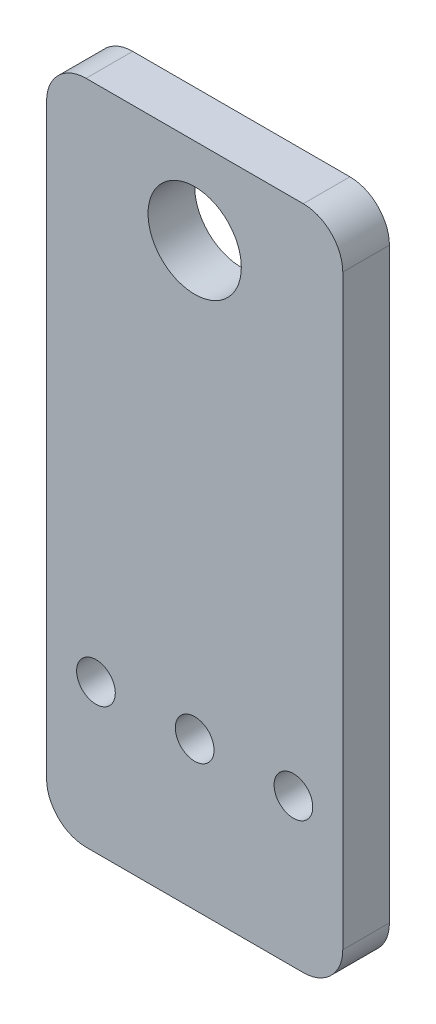
ISO-10303-21;
HEADER;
FILE_DESCRIPTION(('STEP AP214'),'2;1');
FILE_NAME('part.step','',(''),(''),'','','');
FILE_SCHEMA(('AUTOMOTIVE_DESIGN { 1 0 10303 214 1 1 1 1 }'));
ENDSEC;
DATA;
#1=APPLICATION_CONTEXT('core data for automotive mechanical design processes');
#2=APPLICATION_PROTOCOL_DEFINITION('international standard','automotive_design',2000,#1);
#3=PRODUCT_CONTEXT('',#1,'mechanical');
#4=PRODUCT('Part','Part','',(#3));
#5=PRODUCT_RELATED_PRODUCT_CATEGORY('part','',(#4));
#6=PRODUCT_DEFINITION_FORMATION('','',#4);
#7=PRODUCT_DEFINITION_CONTEXT('part definition',#1,'design');
#8=PRODUCT_DEFINITION('design','',#6,#7);
#9=PRODUCT_DEFINITION_SHAPE('','',#8);
#10=(LENGTH_UNIT() NAMED_UNIT(*) SI_UNIT(.MILLI.,.METRE.));
#11=(NAMED_UNIT(*) PLANE_ANGLE_UNIT() SI_UNIT($,.RADIAN.));
#12=(NAMED_UNIT(*) SI_UNIT($,.STERADIAN.) SOLID_ANGLE_UNIT());
#13=UNCERTAINTY_MEASURE_WITH_UNIT(LENGTH_MEASURE(1.E-05),#10,'distance_accuracy_value','');
#14=(GEOMETRIC_REPRESENTATION_CONTEXT(3) GLOBAL_UNCERTAINTY_ASSIGNED_CONTEXT((#13)) GLOBAL_UNIT_ASSIGNED_CONTEXT((#10,
#11,#12)) REPRESENTATION_CONTEXT('',''));
#15=CARTESIAN_POINT('',(0.,0.,0.));
#16=DIRECTION('',(0.,0.,1.));
#17=DIRECTION('',(1.,0.,0.));
#18=AXIS2_PLACEMENT_3D('',#15,#16,#17);
#19=CARTESIAN_POINT('',(-354.33,-13.97,6.));
#20=DIRECTION('',(0.,0.,1.));
#21=DIRECTION('',(1.,0.,0.));
#22=AXIS2_PLACEMENT_3D('',#19,#20,#21);
#23=PLANE('',#22);
#24=CARTESIAN_POINT('',(-381.,0.,6.));
#25=DIRECTION('',(0.,0.,1.));
#26=DIRECTION('',(1.,0.,0.));
#27=AXIS2_PLACEMENT_3D('',#24,#25,#26);
#28=CIRCLE('',#27,2.4892);
#29=CARTESIAN_POINT('',(-378.5108,0.,6.));
#30=VERTEX_POINT('',#29);
#31=EDGE_CURVE('E221',#30,#30,#28,.T.);
#32=ORIENTED_EDGE('',*,*,#31,.F.);
#33=EDGE_LOOP('',(#32));
#34=FACE_BOUND('',#33,.T.);
#35=CARTESIAN_POINT('',(-368.3,0.,6.));
#36=DIRECTION('',(0.,0.,1.));
#37=DIRECTION('',(1.,0.,0.));
#38=AXIS2_PLACEMENT_3D('',#35,#36,#37);
#39=CIRCLE('',#38,2.4892);
#40=CARTESIAN_POINT('',(-365.8108,0.,6.));
#41=VERTEX_POINT('',#40);
#42=EDGE_CURVE('E146',#41,#41,#39,.T.);
#43=ORIENTED_EDGE('',*,*,#42,.F.);
#44=EDGE_LOOP('',(#43));
#45=FACE_BOUND('',#44,.T.);
#46=CARTESIAN_POINT('',(-354.33,-13.97,6.));
#47=DIRECTION('',(0.,0.,1.));
#48=DIRECTION('',(1.,0.,0.));
#49=AXIS2_PLACEMENT_3D('',#46,#47,#48);
#50=CIRCLE('',#49,5.07999999999999);
#51=CARTESIAN_POINT('',(-354.33,-19.05,6.));
#52=VERTEX_POINT('',#51);
#53=CARTESIAN_POINT('',(-349.25,-13.97,6.));
#54=VERTEX_POINT('',#53);
#55=EDGE_CURVE('E164',#52,#54,#50,.T.);
#56=ORIENTED_EDGE('',*,*,#55,.T.);
#57=DIRECTION('',(0.,1.,0.));
#58=VECTOR('',#57,1.);
#59=CARTESIAN_POINT('',(-349.25,-13.97,6.));
#60=LINE('',#59,#58);
#61=CARTESIAN_POINT('',(-349.25,61.53,6.));
#62=VERTEX_POINT('',#61);
#63=EDGE_CURVE('E100',#54,#62,#60,.T.);
#64=ORIENTED_EDGE('',*,*,#63,.T.);
#65=CARTESIAN_POINT('',(-354.33,61.53,6.));
#66=DIRECTION('',(0.,0.,1.));
#67=DIRECTION('',(1.,0.,0.));
#68=AXIS2_PLACEMENT_3D('',#65,#66,#67);
#69=CIRCLE('',#68,5.07999999999999);
#70=CARTESIAN_POINT('',(-354.33,66.61,6.));
#71=VERTEX_POINT('',#70);
#72=EDGE_CURVE('E185',#62,#71,#69,.T.);
#73=ORIENTED_EDGE('',*,*,#72,.T.);
#74=DIRECTION('',(-1.,0.,0.));
#75=VECTOR('',#74,1.);
#76=CARTESIAN_POINT('',(-354.33,66.61,6.));
#77=LINE('',#76,#75);
#78=CARTESIAN_POINT('',(-382.27,66.61,6.));
#79=VERTEX_POINT('',#78);
#80=EDGE_CURVE('E199',#71,#79,#77,.T.);
#81=ORIENTED_EDGE('',*,*,#80,.T.);
#82=CARTESIAN_POINT('',(-382.27,61.53,6.));
#83=DIRECTION('',(0.,0.,1.));
#84=DIRECTION('',(1.,0.,0.));
#85=AXIS2_PLACEMENT_3D('',#82,#83,#84);
#86=CIRCLE('',#85,5.07999999999996);
#87=CARTESIAN_POINT('',(-387.35,61.53,6.));
#88=VERTEX_POINT('',#87);
#89=EDGE_CURVE('E119',#79,#88,#86,.T.);
#90=ORIENTED_EDGE('',*,*,#89,.T.);
#91=DIRECTION('',(0.,-1.,0.));
#92=VECTOR('',#91,1.);
#93=CARTESIAN_POINT('',(-387.35,61.53,6.));
#94=LINE('',#93,#92);
#95=CARTESIAN_POINT('',(-387.35,-13.97,6.));
#96=VERTEX_POINT('',#95);
#97=EDGE_CURVE('E113',#88,#96,#94,.T.);
#98=ORIENTED_EDGE('',*,*,#97,.T.);
#99=CARTESIAN_POINT('',(-382.27,-13.97,6.));
#100=DIRECTION('',(0.,0.,1.));
#101=DIRECTION('',(1.,0.,0.));
#102=AXIS2_PLACEMENT_3D('',#99,#100,#101);
#103=CIRCLE('',#102,5.08000000000002);
#104=CARTESIAN_POINT('',(-382.27,-19.05,6.));
#105=VERTEX_POINT('',#104);
#106=EDGE_CURVE('E117',#96,#105,#103,.T.);
#107=ORIENTED_EDGE('',*,*,#106,.T.);
#108=DIRECTION('',(1.,0.,0.));
#109=VECTOR('',#108,1.);
#110=CARTESIAN_POINT('',(-382.27,-19.05,6.));
#111=LINE('',#110,#109);
#112=EDGE_CURVE('E57',#105,#52,#111,.T.);
#113=ORIENTED_EDGE('',*,*,#112,.T.);
#114=EDGE_LOOP('',(#56,#64,#73,#81,#90,#98,#107,#113));
#115=FACE_BOUND('',#114,.T.);
#116=CARTESIAN_POINT('',(-355.6,0.,6.));
#117=DIRECTION('',(0.,0.,1.));
#118=DIRECTION('',(1.,0.,0.));
#119=AXIS2_PLACEMENT_3D('',#116,#117,#118);
#120=CIRCLE('',#119,2.4892);
#121=CARTESIAN_POINT('',(-353.1108,0.,6.));
#122=VERTEX_POINT('',#121);
#123=EDGE_CURVE('E213',#122,#122,#120,.T.);
#124=ORIENTED_EDGE('',*,*,#123,.F.);
#125=EDGE_LOOP('',(#124));
#126=FACE_BOUND('',#125,.T.);
#127=CARTESIAN_POINT('',(-368.3,55.53,6.));
#128=DIRECTION('',(0.,0.,1.));
#129=DIRECTION('',(1.,0.,0.));
#130=AXIS2_PLACEMENT_3D('',#127,#128,#129);
#131=CIRCLE('',#130,5.99999999999999);
#132=CARTESIAN_POINT('',(-362.3,55.53,6.));
#133=VERTEX_POINT('',#132);
#134=EDGE_CURVE('E229',#133,#133,#131,.T.);
#135=ORIENTED_EDGE('',*,*,#134,.F.);
#136=EDGE_LOOP('',(#135));
#137=FACE_BOUND('',#136,.T.);
#138=ADVANCED_FACE('F39',(#34,#45,#115,#126,#137),#23,.T.);
#139=CARTESIAN_POINT('',(-354.33,-13.97,0.));
#140=DIRECTION('',(0.,0.,1.));
#141=DIRECTION('',(1.,0.,0.));
#142=AXIS2_PLACEMENT_3D('',#139,#140,#141);
#143=PLANE('',#142);
#144=CARTESIAN_POINT('',(-354.33,-13.97,0.));
#145=DIRECTION('',(0.,0.,1.));
#146=DIRECTION('',(1.,0.,0.));
#147=AXIS2_PLACEMENT_3D('',#144,#145,#146);
#148=CIRCLE('',#147,5.07999999999999);
#149=CARTESIAN_POINT('',(-354.33,-19.05,0.));
#150=VERTEX_POINT('',#149);
#151=CARTESIAN_POINT('',(-349.25,-13.97,0.));
#152=VERTEX_POINT('',#151);
#153=EDGE_CURVE('E141',#150,#152,#148,.T.);
#154=ORIENTED_EDGE('',*,*,#153,.F.);
#155=DIRECTION('',(1.,0.,0.));
#156=VECTOR('',#155,1.);
#157=CARTESIAN_POINT('',(-382.27,-19.05,0.));
#158=LINE('',#157,#156);
#159=CARTESIAN_POINT('',(-382.27,-19.05,0.));
#160=VERTEX_POINT('',#159);
#161=EDGE_CURVE('E92',#160,#150,#158,.T.);
#162=ORIENTED_EDGE('',*,*,#161,.F.);
#163=CARTESIAN_POINT('',(-382.27,-13.97,0.));
#164=DIRECTION('',(0.,0.,1.));
#165=DIRECTION('',(1.,0.,0.));
#166=AXIS2_PLACEMENT_3D('',#163,#164,#165);
#167=CIRCLE('',#166,5.08000000000002);
#168=CARTESIAN_POINT('',(-387.35,-13.97,0.));
#169=VERTEX_POINT('',#168);
#170=EDGE_CURVE('E86',#169,#160,#167,.T.);
#171=ORIENTED_EDGE('',*,*,#170,.F.);
#172=DIRECTION('',(0.,-1.,0.));
#173=VECTOR('',#172,1.);
#174=CARTESIAN_POINT('',(-387.35,61.53,0.));
#175=LINE('',#174,#173);
#176=CARTESIAN_POINT('',(-387.35,61.53,0.));
#177=VERTEX_POINT('',#176);
#178=EDGE_CURVE('E128',#177,#169,#175,.T.);
#179=ORIENTED_EDGE('',*,*,#178,.F.);
#180=CARTESIAN_POINT('',(-382.27,61.53,0.));
#181=DIRECTION('',(0.,0.,1.));
#182=DIRECTION('',(1.,0.,0.));
#183=AXIS2_PLACEMENT_3D('',#180,#181,#182);
#184=CIRCLE('',#183,5.07999999999996);
#185=CARTESIAN_POINT('',(-382.27,66.61,0.));
#186=VERTEX_POINT('',#185);
#187=EDGE_CURVE('E155',#186,#177,#184,.T.);
#188=ORIENTED_EDGE('',*,*,#187,.F.);
#189=DIRECTION('',(-1.,0.,0.));
#190=VECTOR('',#189,1.);
#191=CARTESIAN_POINT('',(-354.33,66.61,0.));
#192=LINE('',#191,#190);
#193=CARTESIAN_POINT('',(-354.33,66.61,0.));
#194=VERTEX_POINT('',#193);
#195=EDGE_CURVE('E152',#194,#186,#192,.T.);
#196=ORIENTED_EDGE('',*,*,#195,.F.);
#197=CARTESIAN_POINT('',(-354.33,61.53,0.));
#198=DIRECTION('',(0.,0.,1.));
#199=DIRECTION('',(1.,0.,0.));
#200=AXIS2_PLACEMENT_3D('',#197,#198,#199);
#201=CIRCLE('',#200,5.07999999999999);
#202=CARTESIAN_POINT('',(-349.25,61.53,0.));
#203=VERTEX_POINT('',#202);
#204=EDGE_CURVE('E149',#203,#194,#201,.T.);
#205=ORIENTED_EDGE('',*,*,#204,.F.);
#206=DIRECTION('',(0.,1.,0.));
#207=VECTOR('',#206,1.);
#208=CARTESIAN_POINT('',(-349.25,-13.97,0.));
#209=LINE('',#208,#207);
#210=EDGE_CURVE('E145',#152,#203,#209,.T.);
#211=ORIENTED_EDGE('',*,*,#210,.F.);
#212=EDGE_LOOP('',(#154,#162,#171,#179,#188,#196,#205,#211));
#213=FACE_BOUND('',#212,.T.);
#214=CARTESIAN_POINT('',(-368.3,0.,0.));
#215=DIRECTION('',(0.,0.,1.));
#216=DIRECTION('',(1.,0.,0.));
#217=AXIS2_PLACEMENT_3D('',#214,#215,#216);
#218=CIRCLE('',#217,2.4892);
#219=CARTESIAN_POINT('',(-365.8108,0.,0.));
#220=VERTEX_POINT('',#219);
#221=EDGE_CURVE('E209',#220,#220,#218,.T.);
#222=ORIENTED_EDGE('',*,*,#221,.T.);
#223=EDGE_LOOP('',(#222));
#224=FACE_BOUND('',#223,.T.);
#225=CARTESIAN_POINT('',(-355.6,0.,0.));
#226=DIRECTION('',(0.,0.,1.));
#227=DIRECTION('',(1.,0.,0.));
#228=AXIS2_PLACEMENT_3D('',#225,#226,#227);
#229=CIRCLE('',#228,2.4892);
#230=CARTESIAN_POINT('',(-353.1108,0.,0.));
#231=VERTEX_POINT('',#230);
#232=EDGE_CURVE('E217',#231,#231,#229,.T.);
#233=ORIENTED_EDGE('',*,*,#232,.T.);
#234=EDGE_LOOP('',(#233));
#235=FACE_BOUND('',#234,.T.);
#236=CARTESIAN_POINT('',(-381.,0.,0.));
#237=DIRECTION('',(0.,0.,1.));
#238=DIRECTION('',(1.,0.,0.));
#239=AXIS2_PLACEMENT_3D('',#236,#237,#238);
#240=CIRCLE('',#239,2.4892);
#241=CARTESIAN_POINT('',(-378.5108,0.,0.));
#242=VERTEX_POINT('',#241);
#243=EDGE_CURVE('E225',#242,#242,#240,.T.);
#244=ORIENTED_EDGE('',*,*,#243,.T.);
#245=EDGE_LOOP('',(#244));
#246=FACE_BOUND('',#245,.T.);
#247=CARTESIAN_POINT('',(-368.3,55.53,0.));
#248=DIRECTION('',(0.,0.,1.));
#249=DIRECTION('',(1.,0.,0.));
#250=AXIS2_PLACEMENT_3D('',#247,#248,#249);
#251=CIRCLE('',#250,5.99999999999999);
#252=CARTESIAN_POINT('',(-362.3,55.53,0.));
#253=VERTEX_POINT('',#252);
#254=EDGE_CURVE('E233',#253,#253,#251,.T.);
#255=ORIENTED_EDGE('',*,*,#254,.T.);
#256=EDGE_LOOP('',(#255));
#257=FACE_BOUND('',#256,.T.);
#258=ADVANCED_FACE('F189',(#213,#224,#235,#246,#257),#143,.F.);
#259=CARTESIAN_POINT('',(-354.33,-13.97,6.));
#260=DIRECTION('',(0.,0.,-1.));
#261=DIRECTION('',(-1.,0.,0.));
#262=AXIS2_PLACEMENT_3D('',#259,#260,#261);
#263=CYLINDRICAL_SURFACE('',#262,5.07999999999999);
#264=ORIENTED_EDGE('',*,*,#153,.T.);
#265=DIRECTION('',(0.,0.,-1.));
#266=VECTOR('',#265,1.);
#267=CARTESIAN_POINT('',(-349.25,-13.97,6.));
#268=LINE('',#267,#266);
#269=EDGE_CURVE('E11',#54,#152,#268,.T.);
#270=ORIENTED_EDGE('',*,*,#269,.F.);
#271=ORIENTED_EDGE('',*,*,#55,.F.);
#272=DIRECTION('',(0.,0.,-1.));
#273=VECTOR('',#272,1.);
#274=CARTESIAN_POINT('',(-354.33,-19.05,6.));
#275=LINE('',#274,#273);
#276=EDGE_CURVE('E137',#52,#150,#275,.T.);
#277=ORIENTED_EDGE('',*,*,#276,.T.);
#278=EDGE_LOOP('',(#264,#270,#271,#277));
#279=FACE_BOUND('',#278,.T.);
#280=ADVANCED_FACE('F41',(#279),#263,.T.);
#281=CARTESIAN_POINT('',(-349.25,-13.97,6.));
#282=DIRECTION('',(-1.,0.,0.));
#283=DIRECTION('',(0.,0.,1.));
#284=AXIS2_PLACEMENT_3D('',#281,#282,#283);
#285=PLANE('',#284);
#286=ORIENTED_EDGE('',*,*,#210,.T.);
#287=DIRECTION('',(0.,0.,-1.));
#288=VECTOR('',#287,1.);
#289=CARTESIAN_POINT('',(-349.25,61.53,6.));
#290=LINE('',#289,#288);
#291=EDGE_CURVE('E49',#62,#203,#290,.T.);
#292=ORIENTED_EDGE('',*,*,#291,.F.);
#293=ORIENTED_EDGE('',*,*,#63,.F.);
#294=ORIENTED_EDGE('',*,*,#269,.T.);
#295=EDGE_LOOP('',(#286,#292,#293,#294));
#296=FACE_BOUND('',#295,.T.);
#297=ADVANCED_FACE('F269',(#296),#285,.F.);
#298=CARTESIAN_POINT('',(-354.33,61.53,6.));
#299=DIRECTION('',(0.,0.,-1.));
#300=DIRECTION('',(-1.,0.,0.));
#301=AXIS2_PLACEMENT_3D('',#298,#299,#300);
#302=CYLINDRICAL_SURFACE('',#301,5.07999999999999);
#303=ORIENTED_EDGE('',*,*,#204,.T.);
#304=DIRECTION('',(0.,0.,-1.));
#305=VECTOR('',#304,1.);
#306=CARTESIAN_POINT('',(-354.33,66.61,6.));
#307=LINE('',#306,#305);
#308=EDGE_CURVE('E175',#71,#194,#307,.T.);
#309=ORIENTED_EDGE('',*,*,#308,.F.);
#310=ORIENTED_EDGE('',*,*,#72,.F.);
#311=ORIENTED_EDGE('',*,*,#291,.T.);
#312=EDGE_LOOP('',(#303,#309,#310,#311));
#313=FACE_BOUND('',#312,.T.);
#314=ADVANCED_FACE('F183',(#313),#302,.T.);
#315=CARTESIAN_POINT('',(-354.33,66.61,6.));
#316=DIRECTION('',(0.,-1.,0.));
#317=DIRECTION('',(0.,0.,-1.));
#318=AXIS2_PLACEMENT_3D('',#315,#316,#317);
#319=PLANE('',#318);
#320=ORIENTED_EDGE('',*,*,#195,.T.);
#321=DIRECTION('',(0.,0.,-1.));
#322=VECTOR('',#321,1.);
#323=CARTESIAN_POINT('',(-382.27,66.61,6.));
#324=LINE('',#323,#322);
#325=EDGE_CURVE('E171',#79,#186,#324,.T.);
#326=ORIENTED_EDGE('',*,*,#325,.F.);
#327=ORIENTED_EDGE('',*,*,#80,.F.);
#328=ORIENTED_EDGE('',*,*,#308,.T.);
#329=EDGE_LOOP('',(#320,#326,#327,#328));
#330=FACE_BOUND('',#329,.T.);
#331=ADVANCED_FACE('F194',(#330),#319,.F.);
#332=CARTESIAN_POINT('',(-382.27,61.53,6.));
#333=DIRECTION('',(0.,0.,-1.));
#334=DIRECTION('',(-1.,0.,0.));
#335=AXIS2_PLACEMENT_3D('',#332,#333,#334);
#336=CYLINDRICAL_SURFACE('',#335,5.07999999999996);
#337=ORIENTED_EDGE('',*,*,#187,.T.);
#338=DIRECTION('',(0.,0.,-1.));
#339=VECTOR('',#338,1.);
#340=CARTESIAN_POINT('',(-387.35,61.53,6.));
#341=LINE('',#340,#339);
#342=EDGE_CURVE('E130',#88,#177,#341,.T.);
#343=ORIENTED_EDGE('',*,*,#342,.F.);
#344=ORIENTED_EDGE('',*,*,#89,.F.);
#345=ORIENTED_EDGE('',*,*,#325,.T.);
#346=EDGE_LOOP('',(#337,#343,#344,#345));
#347=FACE_BOUND('',#346,.T.);
#348=ADVANCED_FACE('F197',(#347),#336,.T.);
#349=CARTESIAN_POINT('',(-387.35,61.53,6.));
#350=DIRECTION('',(1.,0.,0.));
#351=DIRECTION('',(0.,1.,0.));
#352=AXIS2_PLACEMENT_3D('',#349,#350,#351);
#353=PLANE('',#352);
#354=ORIENTED_EDGE('',*,*,#178,.T.);
#355=DIRECTION('',(0.,0.,-1.));
#356=VECTOR('',#355,1.);
#357=CARTESIAN_POINT('',(-387.35,-13.97,6.));
#358=LINE('',#357,#356);
#359=EDGE_CURVE('E125',#96,#169,#358,.T.);
#360=ORIENTED_EDGE('',*,*,#359,.F.);
#361=ORIENTED_EDGE('',*,*,#97,.F.);
#362=ORIENTED_EDGE('',*,*,#342,.T.);
#363=EDGE_LOOP('',(#354,#360,#361,#362));
#364=FACE_BOUND('',#363,.T.);
#365=ADVANCED_FACE('F126',(#364),#353,.F.);
#366=CARTESIAN_POINT('',(-382.27,-13.97,6.));
#367=DIRECTION('',(0.,0.,-1.));
#368=DIRECTION('',(-1.,0.,0.));
#369=AXIS2_PLACEMENT_3D('',#366,#367,#368);
#370=CYLINDRICAL_SURFACE('',#369,5.08000000000002);
#371=ORIENTED_EDGE('',*,*,#170,.T.);
#372=DIRECTION('',(0.,0.,-1.));
#373=VECTOR('',#372,1.);
#374=CARTESIAN_POINT('',(-382.27,-19.05,6.));
#375=LINE('',#374,#373);
#376=EDGE_CURVE('E131',#105,#160,#375,.T.);
#377=ORIENTED_EDGE('',*,*,#376,.F.);
#378=ORIENTED_EDGE('',*,*,#106,.F.);
#379=ORIENTED_EDGE('',*,*,#359,.T.);
#380=EDGE_LOOP('',(#371,#377,#378,#379));
#381=FACE_BOUND('',#380,.T.);
#382=ADVANCED_FACE('F133',(#381),#370,.T.);
#383=CARTESIAN_POINT('',(-382.27,-19.05,6.));
#384=DIRECTION('',(0.,1.,0.));
#385=DIRECTION('',(-1.,0.,0.));
#386=AXIS2_PLACEMENT_3D('',#383,#384,#385);
#387=PLANE('',#386);
#388=ORIENTED_EDGE('',*,*,#161,.T.);
#389=ORIENTED_EDGE('',*,*,#276,.F.);
#390=ORIENTED_EDGE('',*,*,#112,.F.);
#391=ORIENTED_EDGE('',*,*,#376,.T.);
#392=EDGE_LOOP('',(#388,#389,#390,#391));
#393=FACE_BOUND('',#392,.T.);
#394=ADVANCED_FACE('F257',(#393),#387,.F.);
#395=CARTESIAN_POINT('',(-368.3,0.,6.));
#396=DIRECTION('',(0.,0.,-1.));
#397=DIRECTION('',(-1.,0.,0.));
#398=AXIS2_PLACEMENT_3D('',#395,#396,#397);
#399=CYLINDRICAL_SURFACE('',#398,2.4892);
#400=ORIENTED_EDGE('',*,*,#42,.T.);
#401=EDGE_LOOP('',(#400));
#402=FACE_BOUND('',#401,.T.);
#403=ORIENTED_EDGE('',*,*,#221,.F.);
#404=EDGE_LOOP('',(#403));
#405=FACE_BOUND('',#404,.T.);
#406=ADVANCED_FACE('F254',(#402,#405),#399,.F.);
#407=CARTESIAN_POINT('',(-355.6,0.,6.));
#408=DIRECTION('',(0.,0.,-1.));
#409=DIRECTION('',(-1.,0.,0.));
#410=AXIS2_PLACEMENT_3D('',#407,#408,#409);
#411=CYLINDRICAL_SURFACE('',#410,2.4892);
#412=ORIENTED_EDGE('',*,*,#123,.T.);
#413=EDGE_LOOP('',(#412));
#414=FACE_BOUND('',#413,.T.);
#415=ORIENTED_EDGE('',*,*,#232,.F.);
#416=EDGE_LOOP('',(#415));
#417=FACE_BOUND('',#416,.T.);
#418=ADVANCED_FACE('F333',(#414,#417),#411,.F.);
#419=CARTESIAN_POINT('',(-381.,0.,6.));
#420=DIRECTION('',(0.,0.,-1.));
#421=DIRECTION('',(-1.,0.,0.));
#422=AXIS2_PLACEMENT_3D('',#419,#420,#421);
#423=CYLINDRICAL_SURFACE('',#422,2.4892);
#424=ORIENTED_EDGE('',*,*,#31,.T.);
#425=EDGE_LOOP('',(#424));
#426=FACE_BOUND('',#425,.T.);
#427=ORIENTED_EDGE('',*,*,#243,.F.);
#428=EDGE_LOOP('',(#427));
#429=FACE_BOUND('',#428,.T.);
#430=ADVANCED_FACE('F341',(#426,#429),#423,.F.);
#431=CARTESIAN_POINT('',(-368.3,55.53,6.));
#432=DIRECTION('',(0.,0.,-1.));
#433=DIRECTION('',(-1.,0.,0.));
#434=AXIS2_PLACEMENT_3D('',#431,#432,#433);
#435=CYLINDRICAL_SURFACE('',#434,5.99999999999999);
#436=ORIENTED_EDGE('',*,*,#134,.T.);
#437=EDGE_LOOP('',(#436));
#438=FACE_BOUND('',#437,.T.);
#439=ORIENTED_EDGE('',*,*,#254,.F.);
#440=EDGE_LOOP('',(#439));
#441=FACE_BOUND('',#440,.T.);
#442=ADVANCED_FACE('F241',(#438,#441),#435,.F.);
#443=CLOSED_SHELL('',(#138,#258,#280,#297,#314,#331,#348,#365,#382,#394,#406,#418,#430,#442));
#444=MANIFOLD_SOLID_BREP('B2',#443);
#445=ADVANCED_BREP_SHAPE_REPRESENTATION('',(#18,#444),#14);
#446=SHAPE_DEFINITION_REPRESENTATION(#9,#445);
ENDSEC;
END-ISO-10303-21;
